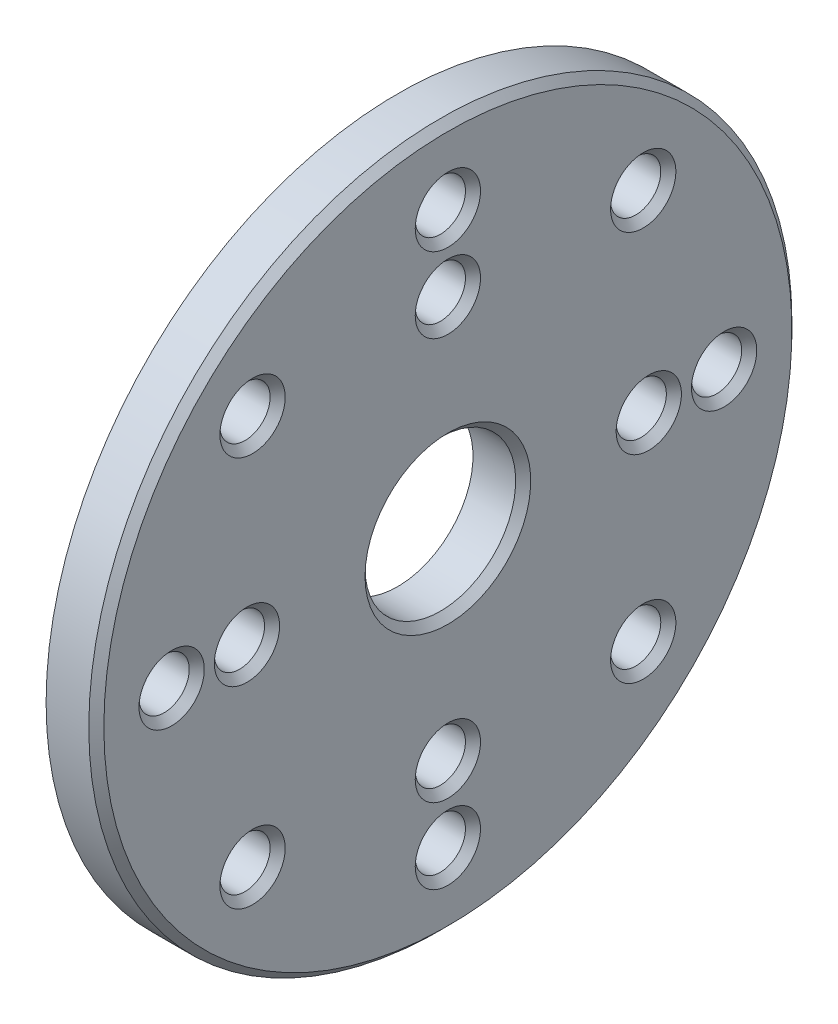
ISO-10303-21;
HEADER;
FILE_DESCRIPTION(('STEP AP214'),'2;1');
FILE_NAME('part.step','',(''),(''),'','','');
FILE_SCHEMA(('AUTOMOTIVE_DESIGN { 1 0 10303 214 1 1 1 1 }'));
ENDSEC;
DATA;
#1=APPLICATION_CONTEXT('core data for automotive mechanical design processes');
#2=APPLICATION_PROTOCOL_DEFINITION('international standard','automotive_design',2000,#1);
#3=PRODUCT_CONTEXT('',#1,'mechanical');
#4=PRODUCT('Part','Part','',(#3));
#5=PRODUCT_RELATED_PRODUCT_CATEGORY('part','',(#4));
#6=PRODUCT_DEFINITION_FORMATION('','',#4);
#7=PRODUCT_DEFINITION_CONTEXT('part definition',#1,'design');
#8=PRODUCT_DEFINITION('design','',#6,#7);
#9=PRODUCT_DEFINITION_SHAPE('','',#8);
#10=(LENGTH_UNIT() NAMED_UNIT(*) SI_UNIT(.MILLI.,.METRE.));
#11=(NAMED_UNIT(*) PLANE_ANGLE_UNIT() SI_UNIT($,.RADIAN.));
#12=(NAMED_UNIT(*) SI_UNIT($,.STERADIAN.) SOLID_ANGLE_UNIT());
#13=UNCERTAINTY_MEASURE_WITH_UNIT(LENGTH_MEASURE(1.E-05),#10,'distance_accuracy_value','');
#14=(GEOMETRIC_REPRESENTATION_CONTEXT(3) GLOBAL_UNCERTAINTY_ASSIGNED_CONTEXT((#13)) GLOBAL_UNIT_ASSIGNED_CONTEXT((#10,
#11,#12)) REPRESENTATION_CONTEXT('',''));
#15=CARTESIAN_POINT('',(0.,0.,0.));
#16=DIRECTION('',(0.,0.,1.));
#17=DIRECTION('',(1.,0.,0.));
#18=AXIS2_PLACEMENT_3D('',#15,#16,#17);
#19=CARTESIAN_POINT('',(-2.,3.,0.));
#20=DIRECTION('',(1.,0.,0.));
#21=DIRECTION('',(0.,0.,-1.));
#22=AXIS2_PLACEMENT_3D('',#19,#20,#21);
#23=PLANE('',#22);
#24=CARTESIAN_POINT('',(-2.,0.,8.));
#25=DIRECTION('',(1.,0.,0.));
#26=DIRECTION('',(0.,1.,0.));
#27=AXIS2_PLACEMENT_3D('',#24,#25,#26);
#28=CIRCLE('',#27,1.);
#29=CARTESIAN_POINT('',(-2.,1.00000000000008,7.99999999999999));
#30=VERTEX_POINT('',#29);
#31=EDGE_CURVE('E161',#30,#30,#28,.T.);
#32=ORIENTED_EDGE('',*,*,#31,.T.);
#33=EDGE_LOOP('',(#32));
#34=FACE_BOUND('',#33,.T.);
#35=CARTESIAN_POINT('',(-2.,-8.,0.));
#36=DIRECTION('',(1.,0.,0.));
#37=DIRECTION('',(0.,0.,1.));
#38=AXIS2_PLACEMENT_3D('',#35,#36,#37);
#39=CIRCLE('',#38,1.);
#40=CARTESIAN_POINT('',(-2.,-8.,1.));
#41=VERTEX_POINT('',#40);
#42=EDGE_CURVE('E158',#41,#41,#39,.T.);
#43=ORIENTED_EDGE('',*,*,#42,.T.);
#44=EDGE_LOOP('',(#43));
#45=FACE_BOUND('',#44,.T.);
#46=CARTESIAN_POINT('',(-2.,0.,-8.));
#47=DIRECTION('',(1.,0.,0.));
#48=DIRECTION('',(0.,-1.,0.));
#49=AXIS2_PLACEMENT_3D('',#46,#47,#48);
#50=CIRCLE('',#49,1.);
#51=CARTESIAN_POINT('',(-2.,-1.00000000000003,-8.));
#52=VERTEX_POINT('',#51);
#53=EDGE_CURVE('E155',#52,#52,#50,.T.);
#54=ORIENTED_EDGE('',*,*,#53,.T.);
#55=EDGE_LOOP('',(#54));
#56=FACE_BOUND('',#55,.T.);
#57=CARTESIAN_POINT('',(-2.,8.,0.));
#58=DIRECTION('',(1.,0.,0.));
#59=DIRECTION('',(0.,0.,-1.));
#60=AXIS2_PLACEMENT_3D('',#57,#58,#59);
#61=CIRCLE('',#60,1.);
#62=CARTESIAN_POINT('',(-2.,8.,-1.));
#63=VERTEX_POINT('',#62);
#64=EDGE_CURVE('E152',#63,#63,#61,.T.);
#65=ORIENTED_EDGE('',*,*,#64,.T.);
#66=EDGE_LOOP('',(#65));
#67=FACE_BOUND('',#66,.T.);
#68=CARTESIAN_POINT('',(-2.,7.77817459305212,7.77817459305193));
#69=DIRECTION('',(1.,0.,0.));
#70=DIRECTION('',(0.,0.707106781186539,-0.707106781186556));
#71=AXIS2_PLACEMENT_3D('',#68,#69,#70);
#72=CIRCLE('',#71,1.);
#73=CARTESIAN_POINT('',(-2.,8.48528137423866,7.07106781186537));
#74=VERTEX_POINT('',#73);
#75=EDGE_CURVE('E149',#74,#74,#72,.T.);
#76=ORIENTED_EDGE('',*,*,#75,.T.);
#77=EDGE_LOOP('',(#76));
#78=FACE_BOUND('',#77,.T.);
#79=CARTESIAN_POINT('',(-2.,1.15218884181823E-13,11.));
#80=DIRECTION('',(1.,0.,0.));
#81=DIRECTION('',(0.,1.,0.));
#82=AXIS2_PLACEMENT_3D('',#79,#80,#81);
#83=CIRCLE('',#82,1.);
#84=CARTESIAN_POINT('',(-2.,1.00000000000012,11.));
#85=VERTEX_POINT('',#84);
#86=EDGE_CURVE('E146',#85,#85,#83,.T.);
#87=ORIENTED_EDGE('',*,*,#86,.T.);
#88=EDGE_LOOP('',(#87));
#89=FACE_BOUND('',#88,.T.);
#90=CARTESIAN_POINT('',(-2.,-7.77817459305195,7.77817459305209));
#91=DIRECTION('',(1.,0.,0.));
#92=DIRECTION('',(0.,0.707106781186554,0.707106781186541));
#93=AXIS2_PLACEMENT_3D('',#90,#91,#92);
#94=CIRCLE('',#93,1.);
#95=CARTESIAN_POINT('',(-2.,-7.0710678118654,8.48528137423863));
#96=VERTEX_POINT('',#95);
#97=EDGE_CURVE('E143',#96,#96,#94,.T.);
#98=ORIENTED_EDGE('',*,*,#97,.T.);
#99=EDGE_LOOP('',(#98));
#100=FACE_BOUND('',#99,.T.);
#101=CARTESIAN_POINT('',(-2.,-11.,0.));
#102=DIRECTION('',(1.,0.,0.));
#103=DIRECTION('',(0.,0.,1.));
#104=AXIS2_PLACEMENT_3D('',#101,#102,#103);
#105=CIRCLE('',#104,1.);
#106=CARTESIAN_POINT('',(-2.,-11.,1.));
#107=VERTEX_POINT('',#106);
#108=EDGE_CURVE('E140',#107,#107,#105,.T.);
#109=ORIENTED_EDGE('',*,*,#108,.T.);
#110=EDGE_LOOP('',(#109));
#111=FACE_BOUND('',#110,.T.);
#112=CARTESIAN_POINT('',(-2.,-7.77817459305206,-7.77817459305198));
#113=DIRECTION('',(1.,0.,0.));
#114=DIRECTION('',(0.,-0.707106781186544,0.707106781186551));
#115=AXIS2_PLACEMENT_3D('',#112,#113,#114);
#116=CIRCLE('',#115,1.);
#117=CARTESIAN_POINT('',(-2.,-8.48528137423861,-7.07106781186543));
#118=VERTEX_POINT('',#117);
#119=EDGE_CURVE('E137',#118,#118,#116,.T.);
#120=ORIENTED_EDGE('',*,*,#119,.T.);
#121=EDGE_LOOP('',(#120));
#122=FACE_BOUND('',#121,.T.);
#123=CARTESIAN_POINT('',(-2.,0.,-11.));
#124=DIRECTION('',(1.,0.,0.));
#125=DIRECTION('',(0.,-1.,0.));
#126=AXIS2_PLACEMENT_3D('',#123,#124,#125);
#127=CIRCLE('',#126,1.);
#128=CARTESIAN_POINT('',(-2.,-1.00000000000004,-11.));
#129=VERTEX_POINT('',#128);
#130=EDGE_CURVE('E134',#129,#129,#127,.T.);
#131=ORIENTED_EDGE('',*,*,#130,.T.);
#132=EDGE_LOOP('',(#131));
#133=FACE_BOUND('',#132,.T.);
#134=CARTESIAN_POINT('',(-2.,7.77817459305201,-7.77817459305204));
#135=DIRECTION('',(1.,0.,0.));
#136=DIRECTION('',(0.,-0.707106781186549,-0.707106781186546));
#137=AXIS2_PLACEMENT_3D('',#134,#135,#136);
#138=CIRCLE('',#137,1.);
#139=CARTESIAN_POINT('',(-2.,7.07106781186546,-8.48528137423858));
#140=VERTEX_POINT('',#139);
#141=EDGE_CURVE('E131',#140,#140,#138,.T.);
#142=ORIENTED_EDGE('',*,*,#141,.T.);
#143=EDGE_LOOP('',(#142));
#144=FACE_BOUND('',#143,.T.);
#145=CARTESIAN_POINT('',(-2.,11.,0.));
#146=DIRECTION('',(1.,0.,0.));
#147=DIRECTION('',(0.,0.,-1.));
#148=AXIS2_PLACEMENT_3D('',#145,#146,#147);
#149=CIRCLE('',#148,1.);
#150=CARTESIAN_POINT('',(-2.,11.,-1.));
#151=VERTEX_POINT('',#150);
#152=EDGE_CURVE('E128',#151,#151,#149,.T.);
#153=ORIENTED_EDGE('',*,*,#152,.T.);
#154=EDGE_LOOP('',(#153));
#155=FACE_BOUND('',#154,.T.);
#156=CARTESIAN_POINT('',(-2.,0.,0.));
#157=DIRECTION('',(-1.,0.,0.));
#158=DIRECTION('',(0.,0.,1.));
#159=AXIS2_PLACEMENT_3D('',#156,#157,#158);
#160=CIRCLE('',#159,3.);
#161=CARTESIAN_POINT('',(-2.,0.,3.));
#162=VERTEX_POINT('',#161);
#163=EDGE_CURVE('E125',#162,#162,#160,.T.);
#164=ORIENTED_EDGE('',*,*,#163,.F.);
#165=EDGE_LOOP('',(#164));
#166=FACE_BOUND('',#165,.T.);
#167=CARTESIAN_POINT('',(-2.,0.,0.));
#168=DIRECTION('',(-1.,0.,0.));
#169=DIRECTION('',(0.,0.,1.));
#170=AXIS2_PLACEMENT_3D('',#167,#168,#169);
#171=CIRCLE('',#170,14.);
#172=CARTESIAN_POINT('',(-2.,0.,14.));
#173=VERTEX_POINT('',#172);
#174=EDGE_CURVE('E122',#173,#173,#171,.T.);
#175=ORIENTED_EDGE('',*,*,#174,.T.);
#176=EDGE_LOOP('',(#175));
#177=FACE_BOUND('',#176,.T.);
#178=ADVANCED_FACE('F30',(#34,#45,#56,#67,#78,#89,#100,#111,#122,#133,#144,#155,#166,#177),#23,.F.);
#179=CARTESIAN_POINT('',(0.,0.,0.));
#180=DIRECTION('',(-1.,0.,0.));
#181=DIRECTION('',(0.,0.,1.));
#182=AXIS2_PLACEMENT_3D('',#179,#180,#181);
#183=CYLINDRICAL_SURFACE('',#182,14.);
#184=CARTESIAN_POINT('',(-0.299999999999997,0.,0.));
#185=DIRECTION('',(-1.,0.,0.));
#186=DIRECTION('',(0.,0.,1.));
#187=AXIS2_PLACEMENT_3D('',#184,#185,#186);
#188=CIRCLE('',#187,14.);
#189=CARTESIAN_POINT('',(-0.299999999999997,0.,14.));
#190=VERTEX_POINT('',#189);
#191=EDGE_CURVE('E74',#190,#190,#188,.T.);
#192=ORIENTED_EDGE('',*,*,#191,.T.);
#193=EDGE_LOOP('',(#192));
#194=FACE_BOUND('',#193,.T.);
#195=ORIENTED_EDGE('',*,*,#174,.F.);
#196=EDGE_LOOP('',(#195));
#197=FACE_BOUND('',#196,.T.);
#198=ADVANCED_FACE('F182',(#194,#197),#183,.T.);
#199=CARTESIAN_POINT('',(0.,14.,0.));
#200=DIRECTION('',(-1.,0.,0.));
#201=DIRECTION('',(0.,0.,1.));
#202=AXIS2_PLACEMENT_3D('',#199,#200,#201);
#203=PLANE('',#202);
#204=CARTESIAN_POINT('',(0.,0.,0.));
#205=DIRECTION('',(-1.,0.,0.));
#206=DIRECTION('',(0.,0.,1.));
#207=AXIS2_PLACEMENT_3D('',#204,#205,#206);
#208=CIRCLE('',#207,3.3);
#209=CARTESIAN_POINT('',(0.,0.,3.3));
#210=VERTEX_POINT('',#209);
#211=EDGE_CURVE('E80',#210,#210,#208,.T.);
#212=ORIENTED_EDGE('',*,*,#211,.T.);
#213=EDGE_LOOP('',(#212));
#214=FACE_BOUND('',#213,.T.);
#215=CARTESIAN_POINT('',(0.,0.,0.));
#216=DIRECTION('',(-1.,0.,0.));
#217=DIRECTION('',(0.,0.,1.));
#218=AXIS2_PLACEMENT_3D('',#215,#216,#217);
#219=CIRCLE('',#218,13.7);
#220=CARTESIAN_POINT('',(0.,0.,13.7));
#221=VERTEX_POINT('',#220);
#222=EDGE_CURVE('E83',#221,#221,#219,.F.);
#223=ORIENTED_EDGE('',*,*,#222,.T.);
#224=EDGE_LOOP('',(#223));
#225=FACE_BOUND('',#224,.T.);
#226=CARTESIAN_POINT('',(0.,11.,0.));
#227=DIRECTION('',(-1.,0.,0.));
#228=DIRECTION('',(0.,0.,1.));
#229=AXIS2_PLACEMENT_3D('',#226,#227,#228);
#230=CIRCLE('',#229,1.30000000000001);
#231=CARTESIAN_POINT('',(0.,11.,1.30000000000001));
#232=VERTEX_POINT('',#231);
#233=EDGE_CURVE('E86',#232,#232,#230,.T.);
#234=ORIENTED_EDGE('',*,*,#233,.T.);
#235=EDGE_LOOP('',(#234));
#236=FACE_BOUND('',#235,.T.);
#237=CARTESIAN_POINT('',(0.,7.77817459305201,-7.77817459305204));
#238=DIRECTION('',(-1.,0.,0.));
#239=DIRECTION('',(0.,0.,1.));
#240=AXIS2_PLACEMENT_3D('',#237,#238,#239);
#241=CIRCLE('',#240,1.3);
#242=CARTESIAN_POINT('',(0.,7.77817459305201,-6.47817459305203));
#243=VERTEX_POINT('',#242);
#244=EDGE_CURVE('E89',#243,#243,#241,.T.);
#245=ORIENTED_EDGE('',*,*,#244,.T.);
#246=EDGE_LOOP('',(#245));
#247=FACE_BOUND('',#246,.T.);
#248=CARTESIAN_POINT('',(0.,0.,-11.));
#249=DIRECTION('',(-1.,0.,0.));
#250=DIRECTION('',(0.,0.,1.));
#251=AXIS2_PLACEMENT_3D('',#248,#249,#250);
#252=CIRCLE('',#251,1.30000000000001);
#253=CARTESIAN_POINT('',(0.,0.,-9.69999999999999));
#254=VERTEX_POINT('',#253);
#255=EDGE_CURVE('E92',#254,#254,#252,.T.);
#256=ORIENTED_EDGE('',*,*,#255,.T.);
#257=EDGE_LOOP('',(#256));
#258=FACE_BOUND('',#257,.T.);
#259=CARTESIAN_POINT('',(0.,-7.77817459305206,-7.77817459305198));
#260=DIRECTION('',(-1.,0.,0.));
#261=DIRECTION('',(0.,0.,1.));
#262=AXIS2_PLACEMENT_3D('',#259,#260,#261);
#263=CIRCLE('',#262,1.3);
#264=CARTESIAN_POINT('',(0.,-7.77817459305206,-6.47817459305198));
#265=VERTEX_POINT('',#264);
#266=EDGE_CURVE('E95',#265,#265,#263,.T.);
#267=ORIENTED_EDGE('',*,*,#266,.T.);
#268=EDGE_LOOP('',(#267));
#269=FACE_BOUND('',#268,.T.);
#270=CARTESIAN_POINT('',(0.,-11.,0.));
#271=DIRECTION('',(-1.,0.,0.));
#272=DIRECTION('',(0.,0.,1.));
#273=AXIS2_PLACEMENT_3D('',#270,#271,#272);
#274=CIRCLE('',#273,1.30000000000001);
#275=CARTESIAN_POINT('',(0.,-11.,1.30000000000001));
#276=VERTEX_POINT('',#275);
#277=EDGE_CURVE('E98',#276,#276,#274,.T.);
#278=ORIENTED_EDGE('',*,*,#277,.T.);
#279=EDGE_LOOP('',(#278));
#280=FACE_BOUND('',#279,.T.);
#281=CARTESIAN_POINT('',(0.,-7.77817459305195,7.77817459305209));
#282=DIRECTION('',(-1.,0.,0.));
#283=DIRECTION('',(0.,0.,1.));
#284=AXIS2_PLACEMENT_3D('',#281,#282,#283);
#285=CIRCLE('',#284,1.30000000000001);
#286=CARTESIAN_POINT('',(0.,-7.77817459305195,9.0781745930521));
#287=VERTEX_POINT('',#286);
#288=EDGE_CURVE('E101',#287,#287,#285,.T.);
#289=ORIENTED_EDGE('',*,*,#288,.T.);
#290=EDGE_LOOP('',(#289));
#291=FACE_BOUND('',#290,.T.);
#292=CARTESIAN_POINT('',(0.,1.15218884181823E-13,11.));
#293=DIRECTION('',(-1.,0.,0.));
#294=DIRECTION('',(0.,0.,1.));
#295=AXIS2_PLACEMENT_3D('',#292,#293,#294);
#296=CIRCLE('',#295,1.30000000000001);
#297=CARTESIAN_POINT('',(0.,1.15218884181823E-13,12.3));
#298=VERTEX_POINT('',#297);
#299=EDGE_CURVE('E104',#298,#298,#296,.T.);
#300=ORIENTED_EDGE('',*,*,#299,.T.);
#301=EDGE_LOOP('',(#300));
#302=FACE_BOUND('',#301,.T.);
#303=CARTESIAN_POINT('',(0.,7.77817459305212,7.77817459305193));
#304=DIRECTION('',(-1.,0.,0.));
#305=DIRECTION('',(0.,0.,1.));
#306=AXIS2_PLACEMENT_3D('',#303,#304,#305);
#307=CIRCLE('',#306,1.30000000000001);
#308=CARTESIAN_POINT('',(0.,7.77817459305212,9.07817459305194));
#309=VERTEX_POINT('',#308);
#310=EDGE_CURVE('E107',#309,#309,#307,.T.);
#311=ORIENTED_EDGE('',*,*,#310,.T.);
#312=EDGE_LOOP('',(#311));
#313=FACE_BOUND('',#312,.T.);
#314=CARTESIAN_POINT('',(0.,8.,0.));
#315=DIRECTION('',(-1.,0.,0.));
#316=DIRECTION('',(0.,0.,1.));
#317=AXIS2_PLACEMENT_3D('',#314,#315,#316);
#318=CIRCLE('',#317,1.30000000000001);
#319=CARTESIAN_POINT('',(0.,8.,1.30000000000001));
#320=VERTEX_POINT('',#319);
#321=EDGE_CURVE('E110',#320,#320,#318,.T.);
#322=ORIENTED_EDGE('',*,*,#321,.T.);
#323=EDGE_LOOP('',(#322));
#324=FACE_BOUND('',#323,.T.);
#325=CARTESIAN_POINT('',(0.,0.,-8.));
#326=DIRECTION('',(-1.,0.,0.));
#327=DIRECTION('',(0.,0.,1.));
#328=AXIS2_PLACEMENT_3D('',#325,#326,#327);
#329=CIRCLE('',#328,1.30000000000001);
#330=CARTESIAN_POINT('',(0.,0.,-6.69999999999999));
#331=VERTEX_POINT('',#330);
#332=EDGE_CURVE('E113',#331,#331,#329,.T.);
#333=ORIENTED_EDGE('',*,*,#332,.T.);
#334=EDGE_LOOP('',(#333));
#335=FACE_BOUND('',#334,.T.);
#336=CARTESIAN_POINT('',(0.,-8.,0.));
#337=DIRECTION('',(-1.,0.,0.));
#338=DIRECTION('',(0.,0.,1.));
#339=AXIS2_PLACEMENT_3D('',#336,#337,#338);
#340=CIRCLE('',#339,1.30000000000001);
#341=CARTESIAN_POINT('',(0.,-8.,1.30000000000001));
#342=VERTEX_POINT('',#341);
#343=EDGE_CURVE('E116',#342,#342,#340,.T.);
#344=ORIENTED_EDGE('',*,*,#343,.T.);
#345=EDGE_LOOP('',(#344));
#346=FACE_BOUND('',#345,.T.);
#347=CARTESIAN_POINT('',(0.,0.,8.));
#348=DIRECTION('',(-1.,0.,0.));
#349=DIRECTION('',(0.,0.,1.));
#350=AXIS2_PLACEMENT_3D('',#347,#348,#349);
#351=CIRCLE('',#350,1.30000000000001);
#352=CARTESIAN_POINT('',(0.,0.,9.30000000000001));
#353=VERTEX_POINT('',#352);
#354=EDGE_CURVE('E119',#353,#353,#351,.T.);
#355=ORIENTED_EDGE('',*,*,#354,.T.);
#356=EDGE_LOOP('',(#355));
#357=FACE_BOUND('',#356,.T.);
#358=ADVANCED_FACE('F187',(#214,#225,#236,#247,#258,#269,#280,#291,#302,#313,#324,#335,#346,
#357),#203,.F.);
#359=CARTESIAN_POINT('',(0.,0.,0.));
#360=DIRECTION('',(-1.,0.,0.));
#361=DIRECTION('',(0.,0.,1.));
#362=AXIS2_PLACEMENT_3D('',#359,#360,#361);
#363=CYLINDRICAL_SURFACE('',#362,3.);
#364=CARTESIAN_POINT('',(-0.299999999999999,0.,0.));
#365=DIRECTION('',(-1.,0.,0.));
#366=DIRECTION('',(0.,0.,1.));
#367=AXIS2_PLACEMENT_3D('',#364,#365,#366);
#368=CIRCLE('',#367,3.);
#369=CARTESIAN_POINT('',(-0.299999999999999,0.,3.));
#370=VERTEX_POINT('',#369);
#371=EDGE_CURVE('E77',#370,#370,#368,.F.);
#372=ORIENTED_EDGE('',*,*,#371,.T.);
#373=EDGE_LOOP('',(#372));
#374=FACE_BOUND('',#373,.T.);
#375=ORIENTED_EDGE('',*,*,#163,.T.);
#376=EDGE_LOOP('',(#375));
#377=FACE_BOUND('',#376,.T.);
#378=ADVANCED_FACE('F246',(#374,#377),#363,.F.);
#379=CARTESIAN_POINT('',(-2.,11.,0.));
#380=DIRECTION('',(1.,0.,0.));
#381=DIRECTION('',(0.,0.,-1.));
#382=AXIS2_PLACEMENT_3D('',#379,#380,#381);
#383=CYLINDRICAL_SURFACE('',#382,1.);
#384=CARTESIAN_POINT('',(-0.30000000000001,11.,0.));
#385=DIRECTION('',(-1.,0.,0.));
#386=DIRECTION('',(0.,0.,1.));
#387=AXIS2_PLACEMENT_3D('',#384,#385,#386);
#388=CIRCLE('',#387,1.);
#389=CARTESIAN_POINT('',(-0.30000000000001,11.,1.));
#390=VERTEX_POINT('',#389);
#391=EDGE_CURVE('E71',#390,#390,#388,.F.);
#392=ORIENTED_EDGE('',*,*,#391,.T.);
#393=EDGE_LOOP('',(#392));
#394=FACE_BOUND('',#393,.T.);
#395=ORIENTED_EDGE('',*,*,#152,.F.);
#396=EDGE_LOOP('',(#395));
#397=FACE_BOUND('',#396,.T.);
#398=ADVANCED_FACE('F253',(#394,#397),#383,.F.);
#399=CARTESIAN_POINT('',(-2.,7.77817459305201,-7.77817459305204));
#400=DIRECTION('',(1.,0.,0.));
#401=DIRECTION('',(0.,0.,-1.));
#402=AXIS2_PLACEMENT_3D('',#399,#400,#401);
#403=CYLINDRICAL_SURFACE('',#402,1.);
#404=CARTESIAN_POINT('',(-0.3,7.77817459305201,-7.77817459305204));
#405=DIRECTION('',(-1.,0.,0.));
#406=DIRECTION('',(0.,0.,1.));
#407=AXIS2_PLACEMENT_3D('',#404,#405,#406);
#408=CIRCLE('',#407,1.);
#409=CARTESIAN_POINT('',(-0.3,7.77817459305201,-6.77817459305204));
#410=VERTEX_POINT('',#409);
#411=EDGE_CURVE('E68',#410,#410,#408,.F.);
#412=ORIENTED_EDGE('',*,*,#411,.T.);
#413=EDGE_LOOP('',(#412));
#414=FACE_BOUND('',#413,.T.);
#415=ORIENTED_EDGE('',*,*,#141,.F.);
#416=EDGE_LOOP('',(#415));
#417=FACE_BOUND('',#416,.T.);
#418=ADVANCED_FACE('F260',(#414,#417),#403,.F.);
#419=CARTESIAN_POINT('',(-2.,0.,-11.));
#420=DIRECTION('',(1.,0.,0.));
#421=DIRECTION('',(0.,0.,-1.));
#422=AXIS2_PLACEMENT_3D('',#419,#420,#421);
#423=CYLINDRICAL_SURFACE('',#422,1.);
#424=CARTESIAN_POINT('',(-0.30000000000001,0.,-11.));
#425=DIRECTION('',(-1.,0.,0.));
#426=DIRECTION('',(0.,0.,1.));
#427=AXIS2_PLACEMENT_3D('',#424,#425,#426);
#428=CIRCLE('',#427,1.);
#429=CARTESIAN_POINT('',(-0.30000000000001,0.,-10.));
#430=VERTEX_POINT('',#429);
#431=EDGE_CURVE('E65',#430,#430,#428,.F.);
#432=ORIENTED_EDGE('',*,*,#431,.T.);
#433=EDGE_LOOP('',(#432));
#434=FACE_BOUND('',#433,.T.);
#435=ORIENTED_EDGE('',*,*,#130,.F.);
#436=EDGE_LOOP('',(#435));
#437=FACE_BOUND('',#436,.T.);
#438=ADVANCED_FACE('F264',(#434,#437),#423,.F.);
#439=CARTESIAN_POINT('',(-2.,-7.77817459305206,-7.77817459305198));
#440=DIRECTION('',(1.,0.,0.));
#441=DIRECTION('',(0.,0.,-1.));
#442=AXIS2_PLACEMENT_3D('',#439,#440,#441);
#443=CYLINDRICAL_SURFACE('',#442,1.);
#444=CARTESIAN_POINT('',(-0.299999999999993,-7.77817459305206,-7.77817459305198));
#445=DIRECTION('',(-1.,0.,0.));
#446=DIRECTION('',(0.,0.,1.));
#447=AXIS2_PLACEMENT_3D('',#444,#445,#446);
#448=CIRCLE('',#447,1.);
#449=CARTESIAN_POINT('',(-0.299999999999993,-7.77817459305206,-6.77817459305198));
#450=VERTEX_POINT('',#449);
#451=EDGE_CURVE('E62',#450,#450,#448,.F.);
#452=ORIENTED_EDGE('',*,*,#451,.T.);
#453=EDGE_LOOP('',(#452));
#454=FACE_BOUND('',#453,.T.);
#455=ORIENTED_EDGE('',*,*,#119,.F.);
#456=EDGE_LOOP('',(#455));
#457=FACE_BOUND('',#456,.T.);
#458=ADVANCED_FACE('F268',(#454,#457),#443,.F.);
#459=CARTESIAN_POINT('',(-2.,-11.,0.));
#460=DIRECTION('',(1.,0.,0.));
#461=DIRECTION('',(0.,0.,-1.));
#462=AXIS2_PLACEMENT_3D('',#459,#460,#461);
#463=CYLINDRICAL_SURFACE('',#462,1.);
#464=CARTESIAN_POINT('',(-0.30000000000001,-11.,0.));
#465=DIRECTION('',(-1.,0.,0.));
#466=DIRECTION('',(0.,0.,1.));
#467=AXIS2_PLACEMENT_3D('',#464,#465,#466);
#468=CIRCLE('',#467,1.);
#469=CARTESIAN_POINT('',(-0.30000000000001,-11.,1.));
#470=VERTEX_POINT('',#469);
#471=EDGE_CURVE('E59',#470,#470,#468,.F.);
#472=ORIENTED_EDGE('',*,*,#471,.T.);
#473=EDGE_LOOP('',(#472));
#474=FACE_BOUND('',#473,.T.);
#475=ORIENTED_EDGE('',*,*,#108,.F.);
#476=EDGE_LOOP('',(#475));
#477=FACE_BOUND('',#476,.T.);
#478=ADVANCED_FACE('F272',(#474,#477),#463,.F.);
#479=CARTESIAN_POINT('',(-2.,-7.77817459305195,7.77817459305209));
#480=DIRECTION('',(1.,0.,0.));
#481=DIRECTION('',(0.,0.,-1.));
#482=AXIS2_PLACEMENT_3D('',#479,#480,#481);
#483=CYLINDRICAL_SURFACE('',#482,1.);
#484=CARTESIAN_POINT('',(-0.30000000000001,-7.77817459305195,7.77817459305209));
#485=DIRECTION('',(-1.,0.,0.));
#486=DIRECTION('',(0.,0.,1.));
#487=AXIS2_PLACEMENT_3D('',#484,#485,#486);
#488=CIRCLE('',#487,1.);
#489=CARTESIAN_POINT('',(-0.30000000000001,-7.77817459305195,8.77817459305209));
#490=VERTEX_POINT('',#489);
#491=EDGE_CURVE('E56',#490,#490,#488,.F.);
#492=ORIENTED_EDGE('',*,*,#491,.T.);
#493=EDGE_LOOP('',(#492));
#494=FACE_BOUND('',#493,.T.);
#495=ORIENTED_EDGE('',*,*,#97,.F.);
#496=EDGE_LOOP('',(#495));
#497=FACE_BOUND('',#496,.T.);
#498=ADVANCED_FACE('F276',(#494,#497),#483,.F.);
#499=CARTESIAN_POINT('',(-2.,1.15218884181823E-13,11.));
#500=DIRECTION('',(1.,0.,0.));
#501=DIRECTION('',(0.,0.,-1.));
#502=AXIS2_PLACEMENT_3D('',#499,#500,#501);
#503=CYLINDRICAL_SURFACE('',#502,1.);
#504=CARTESIAN_POINT('',(-0.30000000000001,1.15218884181823E-13,11.));
#505=DIRECTION('',(-1.,0.,0.));
#506=DIRECTION('',(0.,0.,1.));
#507=AXIS2_PLACEMENT_3D('',#504,#505,#506);
#508=CIRCLE('',#507,1.);
#509=CARTESIAN_POINT('',(-0.30000000000001,1.15218884181823E-13,12.));
#510=VERTEX_POINT('',#509);
#511=EDGE_CURVE('E53',#510,#510,#508,.F.);
#512=ORIENTED_EDGE('',*,*,#511,.T.);
#513=EDGE_LOOP('',(#512));
#514=FACE_BOUND('',#513,.T.);
#515=ORIENTED_EDGE('',*,*,#86,.F.);
#516=EDGE_LOOP('',(#515));
#517=FACE_BOUND('',#516,.T.);
#518=ADVANCED_FACE('F280',(#514,#517),#503,.F.);
#519=CARTESIAN_POINT('',(-2.,7.77817459305212,7.77817459305193));
#520=DIRECTION('',(1.,0.,0.));
#521=DIRECTION('',(0.,0.,-1.));
#522=AXIS2_PLACEMENT_3D('',#519,#520,#521);
#523=CYLINDRICAL_SURFACE('',#522,1.);
#524=CARTESIAN_POINT('',(-0.30000000000001,7.77817459305212,7.77817459305193));
#525=DIRECTION('',(-1.,0.,0.));
#526=DIRECTION('',(0.,0.,1.));
#527=AXIS2_PLACEMENT_3D('',#524,#525,#526);
#528=CIRCLE('',#527,1.);
#529=CARTESIAN_POINT('',(-0.30000000000001,7.77817459305212,8.77817459305193));
#530=VERTEX_POINT('',#529);
#531=EDGE_CURVE('E50',#530,#530,#528,.F.);
#532=ORIENTED_EDGE('',*,*,#531,.T.);
#533=EDGE_LOOP('',(#532));
#534=FACE_BOUND('',#533,.T.);
#535=ORIENTED_EDGE('',*,*,#75,.F.);
#536=EDGE_LOOP('',(#535));
#537=FACE_BOUND('',#536,.T.);
#538=ADVANCED_FACE('F284',(#534,#537),#523,.F.);
#539=CARTESIAN_POINT('',(-2.,8.,0.));
#540=DIRECTION('',(1.,0.,0.));
#541=DIRECTION('',(0.,0.,-1.));
#542=AXIS2_PLACEMENT_3D('',#539,#540,#541);
#543=CYLINDRICAL_SURFACE('',#542,1.);
#544=CARTESIAN_POINT('',(-0.30000000000001,8.,0.));
#545=DIRECTION('',(-1.,0.,0.));
#546=DIRECTION('',(0.,0.,1.));
#547=AXIS2_PLACEMENT_3D('',#544,#545,#546);
#548=CIRCLE('',#547,1.);
#549=CARTESIAN_POINT('',(-0.30000000000001,8.,1.));
#550=VERTEX_POINT('',#549);
#551=EDGE_CURVE('E45',#550,#550,#548,.F.);
#552=ORIENTED_EDGE('',*,*,#551,.T.);
#553=EDGE_LOOP('',(#552));
#554=FACE_BOUND('',#553,.T.);
#555=ORIENTED_EDGE('',*,*,#64,.F.);
#556=EDGE_LOOP('',(#555));
#557=FACE_BOUND('',#556,.T.);
#558=ADVANCED_FACE('F288',(#554,#557),#543,.F.);
#559=CARTESIAN_POINT('',(-2.,0.,-8.));
#560=DIRECTION('',(1.,0.,0.));
#561=DIRECTION('',(0.,0.,-1.));
#562=AXIS2_PLACEMENT_3D('',#559,#560,#561);
#563=CYLINDRICAL_SURFACE('',#562,1.);
#564=CARTESIAN_POINT('',(-0.30000000000001,0.,-8.));
#565=DIRECTION('',(-1.,0.,0.));
#566=DIRECTION('',(0.,0.,1.));
#567=AXIS2_PLACEMENT_3D('',#564,#565,#566);
#568=CIRCLE('',#567,1.);
#569=CARTESIAN_POINT('',(-0.30000000000001,0.,-7.));
#570=VERTEX_POINT('',#569);
#571=EDGE_CURVE('E41',#570,#570,#568,.F.);
#572=ORIENTED_EDGE('',*,*,#571,.T.);
#573=EDGE_LOOP('',(#572));
#574=FACE_BOUND('',#573,.T.);
#575=ORIENTED_EDGE('',*,*,#53,.F.);
#576=EDGE_LOOP('',(#575));
#577=FACE_BOUND('',#576,.T.);
#578=ADVANCED_FACE('F179',(#574,#577),#563,.F.);
#579=CARTESIAN_POINT('',(-2.,-8.,0.));
#580=DIRECTION('',(1.,0.,0.));
#581=DIRECTION('',(0.,0.,-1.));
#582=AXIS2_PLACEMENT_3D('',#579,#580,#581);
#583=CYLINDRICAL_SURFACE('',#582,1.);
#584=CARTESIAN_POINT('',(-0.30000000000001,-8.,0.));
#585=DIRECTION('',(-1.,0.,0.));
#586=DIRECTION('',(0.,0.,1.));
#587=AXIS2_PLACEMENT_3D('',#584,#585,#586);
#588=CIRCLE('',#587,1.);
#589=CARTESIAN_POINT('',(-0.30000000000001,-8.,1.));
#590=VERTEX_POINT('',#589);
#591=EDGE_CURVE('E37',#590,#590,#588,.F.);
#592=ORIENTED_EDGE('',*,*,#591,.T.);
#593=EDGE_LOOP('',(#592));
#594=FACE_BOUND('',#593,.T.);
#595=ORIENTED_EDGE('',*,*,#42,.F.);
#596=EDGE_LOOP('',(#595));
#597=FACE_BOUND('',#596,.T.);
#598=ADVANCED_FACE('F170',(#594,#597),#583,.F.);
#599=CARTESIAN_POINT('',(-2.,0.,8.));
#600=DIRECTION('',(1.,0.,0.));
#601=DIRECTION('',(0.,0.,-1.));
#602=AXIS2_PLACEMENT_3D('',#599,#600,#601);
#603=CYLINDRICAL_SURFACE('',#602,1.);
#604=CARTESIAN_POINT('',(-0.30000000000001,0.,8.));
#605=DIRECTION('',(-1.,0.,0.));
#606=DIRECTION('',(0.,0.,1.));
#607=AXIS2_PLACEMENT_3D('',#604,#605,#606);
#608=CIRCLE('',#607,1.);
#609=CARTESIAN_POINT('',(-0.30000000000001,0.,9.));
#610=VERTEX_POINT('',#609);
#611=EDGE_CURVE('E10',#610,#610,#608,.F.);
#612=ORIENTED_EDGE('',*,*,#611,.T.);
#613=EDGE_LOOP('',(#612));
#614=FACE_BOUND('',#613,.T.);
#615=ORIENTED_EDGE('',*,*,#31,.F.);
#616=EDGE_LOOP('',(#615));
#617=FACE_BOUND('',#616,.T.);
#618=ADVANCED_FACE('F167',(#614,#617),#603,.F.);
#619=CARTESIAN_POINT('',(0.,0.,0.));
#620=DIRECTION('',(1.,0.,0.));
#621=DIRECTION('',(0.,0.,-1.));
#622=AXIS2_PLACEMENT_3D('',#619,#620,#621);
#623=CONICAL_SURFACE('',#622,3.3,0.785398163397454);
#624=ORIENTED_EDGE('',*,*,#371,.F.);
#625=EDGE_LOOP('',(#624));
#626=FACE_BOUND('',#625,.T.);
#627=ORIENTED_EDGE('',*,*,#211,.F.);
#628=EDGE_LOOP('',(#627));
#629=FACE_BOUND('',#628,.T.);
#630=ADVANCED_FACE('F169',(#626,#629),#623,.F.);
#631=CARTESIAN_POINT('',(-0.299999999999997,0.,0.));
#632=DIRECTION('',(-1.,0.,0.));
#633=DIRECTION('',(0.,0.,1.));
#634=AXIS2_PLACEMENT_3D('',#631,#632,#633);
#635=CONICAL_SURFACE('',#634,14.,0.785398163397451);
#636=ORIENTED_EDGE('',*,*,#222,.F.);
#637=EDGE_LOOP('',(#636));
#638=FACE_BOUND('',#637,.T.);
#639=ORIENTED_EDGE('',*,*,#191,.F.);
#640=EDGE_LOOP('',(#639));
#641=FACE_BOUND('',#640,.T.);
#642=ADVANCED_FACE('F176',(#638,#641),#635,.T.);
#643=CARTESIAN_POINT('',(-0.30000000000001,11.,0.));
#644=DIRECTION('',(1.,0.,0.));
#645=DIRECTION('',(0.,0.,-1.));
#646=AXIS2_PLACEMENT_3D('',#643,#644,#645);
#647=CONICAL_SURFACE('',#646,1.,0.785398163397448);
#648=ORIENTED_EDGE('',*,*,#233,.F.);
#649=EDGE_LOOP('',(#648));
#650=FACE_BOUND('',#649,.T.);
#651=ORIENTED_EDGE('',*,*,#391,.F.);
#652=EDGE_LOOP('',(#651));
#653=FACE_BOUND('',#652,.T.);
#654=ADVANCED_FACE('F194',(#650,#653),#647,.F.);
#655=CARTESIAN_POINT('',(-0.3,7.77817459305201,-7.77817459305204));
#656=DIRECTION('',(1.,0.,0.));
#657=DIRECTION('',(0.,0.,-1.));
#658=AXIS2_PLACEMENT_3D('',#655,#656,#657);
#659=CONICAL_SURFACE('',#658,1.,0.785398163397449);
#660=ORIENTED_EDGE('',*,*,#244,.F.);
#661=EDGE_LOOP('',(#660));
#662=FACE_BOUND('',#661,.T.);
#663=ORIENTED_EDGE('',*,*,#411,.F.);
#664=EDGE_LOOP('',(#663));
#665=FACE_BOUND('',#664,.T.);
#666=ADVANCED_FACE('F198',(#662,#665),#659,.F.);
#667=CARTESIAN_POINT('',(-0.30000000000001,0.,-11.));
#668=DIRECTION('',(1.,0.,0.));
#669=DIRECTION('',(0.,0.,-1.));
#670=AXIS2_PLACEMENT_3D('',#667,#668,#669);
#671=CONICAL_SURFACE('',#670,1.,0.785398163397448);
#672=ORIENTED_EDGE('',*,*,#255,.F.);
#673=EDGE_LOOP('',(#672));
#674=FACE_BOUND('',#673,.T.);
#675=ORIENTED_EDGE('',*,*,#431,.F.);
#676=EDGE_LOOP('',(#675));
#677=FACE_BOUND('',#676,.T.);
#678=ADVANCED_FACE('F202',(#674,#677),#671,.F.);
#679=CARTESIAN_POINT('',(-0.299999999999993,-7.77817459305206,-7.77817459305198));
#680=DIRECTION('',(1.,0.,0.));
#681=DIRECTION('',(0.,0.,-1.));
#682=AXIS2_PLACEMENT_3D('',#679,#680,#681);
#683=CONICAL_SURFACE('',#682,1.,0.785398163397454);
#684=ORIENTED_EDGE('',*,*,#266,.F.);
#685=EDGE_LOOP('',(#684));
#686=FACE_BOUND('',#685,.T.);
#687=ORIENTED_EDGE('',*,*,#451,.F.);
#688=EDGE_LOOP('',(#687));
#689=FACE_BOUND('',#688,.T.);
#690=ADVANCED_FACE('F206',(#686,#689),#683,.F.);
#691=CARTESIAN_POINT('',(-0.30000000000001,-11.,0.));
#692=DIRECTION('',(1.,0.,0.));
#693=DIRECTION('',(0.,0.,-1.));
#694=AXIS2_PLACEMENT_3D('',#691,#692,#693);
#695=CONICAL_SURFACE('',#694,1.,0.785398163397448);
#696=ORIENTED_EDGE('',*,*,#277,.F.);
#697=EDGE_LOOP('',(#696));
#698=FACE_BOUND('',#697,.T.);
#699=ORIENTED_EDGE('',*,*,#471,.F.);
#700=EDGE_LOOP('',(#699));
#701=FACE_BOUND('',#700,.T.);
#702=ADVANCED_FACE('F210',(#698,#701),#695,.F.);
#703=CARTESIAN_POINT('',(-0.30000000000001,-7.77817459305195,7.77817459305209));
#704=DIRECTION('',(1.,0.,0.));
#705=DIRECTION('',(0.,0.,-1.));
#706=AXIS2_PLACEMENT_3D('',#703,#704,#705);
#707=CONICAL_SURFACE('',#706,1.,0.78539816339745);
#708=ORIENTED_EDGE('',*,*,#288,.F.);
#709=EDGE_LOOP('',(#708));
#710=FACE_BOUND('',#709,.T.);
#711=ORIENTED_EDGE('',*,*,#491,.F.);
#712=EDGE_LOOP('',(#711));
#713=FACE_BOUND('',#712,.T.);
#714=ADVANCED_FACE('F214',(#710,#713),#707,.F.);
#715=CARTESIAN_POINT('',(-0.30000000000001,1.15218884181823E-13,11.));
#716=DIRECTION('',(1.,0.,0.));
#717=DIRECTION('',(0.,0.,-1.));
#718=AXIS2_PLACEMENT_3D('',#715,#716,#717);
#719=CONICAL_SURFACE('',#718,1.,0.785398163397448);
#720=ORIENTED_EDGE('',*,*,#299,.F.);
#721=EDGE_LOOP('',(#720));
#722=FACE_BOUND('',#721,.T.);
#723=ORIENTED_EDGE('',*,*,#511,.F.);
#724=EDGE_LOOP('',(#723));
#725=FACE_BOUND('',#724,.T.);
#726=ADVANCED_FACE('F218',(#722,#725),#719,.F.);
#727=CARTESIAN_POINT('',(-0.30000000000001,7.77817459305212,7.77817459305193));
#728=DIRECTION('',(1.,0.,0.));
#729=DIRECTION('',(0.,0.,-1.));
#730=AXIS2_PLACEMENT_3D('',#727,#728,#729);
#731=CONICAL_SURFACE('',#730,1.,0.78539816339745);
#732=ORIENTED_EDGE('',*,*,#310,.F.);
#733=EDGE_LOOP('',(#732));
#734=FACE_BOUND('',#733,.T.);
#735=ORIENTED_EDGE('',*,*,#531,.F.);
#736=EDGE_LOOP('',(#735));
#737=FACE_BOUND('',#736,.T.);
#738=ADVANCED_FACE('F222',(#734,#737),#731,.F.);
#739=CARTESIAN_POINT('',(-0.30000000000001,8.,0.));
#740=DIRECTION('',(1.,0.,0.));
#741=DIRECTION('',(0.,0.,-1.));
#742=AXIS2_PLACEMENT_3D('',#739,#740,#741);
#743=CONICAL_SURFACE('',#742,1.,0.785398163397448);
#744=ORIENTED_EDGE('',*,*,#321,.F.);
#745=EDGE_LOOP('',(#744));
#746=FACE_BOUND('',#745,.T.);
#747=ORIENTED_EDGE('',*,*,#551,.F.);
#748=EDGE_LOOP('',(#747));
#749=FACE_BOUND('',#748,.T.);
#750=ADVANCED_FACE('F226',(#746,#749),#743,.F.);
#751=CARTESIAN_POINT('',(-0.30000000000001,0.,-8.));
#752=DIRECTION('',(1.,0.,0.));
#753=DIRECTION('',(0.,0.,-1.));
#754=AXIS2_PLACEMENT_3D('',#751,#752,#753);
#755=CONICAL_SURFACE('',#754,1.,0.785398163397448);
#756=ORIENTED_EDGE('',*,*,#332,.F.);
#757=EDGE_LOOP('',(#756));
#758=FACE_BOUND('',#757,.T.);
#759=ORIENTED_EDGE('',*,*,#571,.F.);
#760=EDGE_LOOP('',(#759));
#761=FACE_BOUND('',#760,.T.);
#762=ADVANCED_FACE('F230',(#758,#761),#755,.F.);
#763=CARTESIAN_POINT('',(-0.30000000000001,-8.,0.));
#764=DIRECTION('',(1.,0.,0.));
#765=DIRECTION('',(0.,0.,-1.));
#766=AXIS2_PLACEMENT_3D('',#763,#764,#765);
#767=CONICAL_SURFACE('',#766,1.,0.785398163397448);
#768=ORIENTED_EDGE('',*,*,#343,.F.);
#769=EDGE_LOOP('',(#768));
#770=FACE_BOUND('',#769,.T.);
#771=ORIENTED_EDGE('',*,*,#591,.F.);
#772=EDGE_LOOP('',(#771));
#773=FACE_BOUND('',#772,.T.);
#774=ADVANCED_FACE('F233',(#770,#773),#767,.F.);
#775=CARTESIAN_POINT('',(-0.30000000000001,0.,8.));
#776=DIRECTION('',(1.,0.,0.));
#777=DIRECTION('',(0.,0.,-1.));
#778=AXIS2_PLACEMENT_3D('',#775,#776,#777);
#779=CONICAL_SURFACE('',#778,1.,0.785398163397448);
#780=ORIENTED_EDGE('',*,*,#354,.F.);
#781=EDGE_LOOP('',(#780));
#782=FACE_BOUND('',#781,.T.);
#783=ORIENTED_EDGE('',*,*,#611,.F.);
#784=EDGE_LOOP('',(#783));
#785=FACE_BOUND('',#784,.T.);
#786=ADVANCED_FACE('F32',(#782,#785),#779,.F.);
#787=CLOSED_SHELL('',(#178,#198,#358,#378,#398,#418,#438,#458,#478,#498,#518,#538,#558,#578,
#598,#618,#630,#642,#654,#666,#678,#690,#702,#714,#726,#738,#750,#762,#774,#786));
#788=MANIFOLD_SOLID_BREP('B2',#787);
#789=ADVANCED_BREP_SHAPE_REPRESENTATION('',(#18,#788),#14);
#790=SHAPE_DEFINITION_REPRESENTATION(#9,#789);
ENDSEC;
END-ISO-10303-21;
